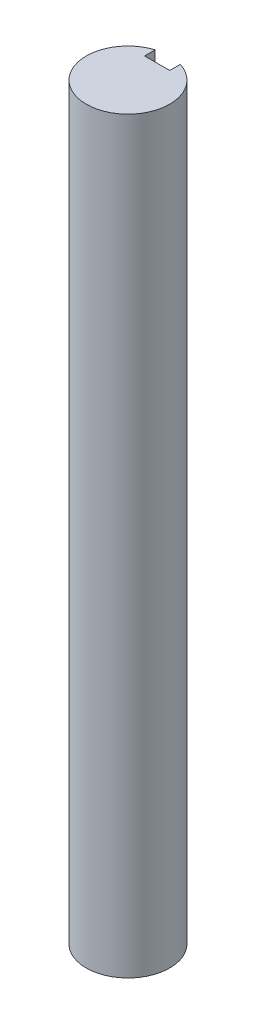
ISO-10303-21;
HEADER;
FILE_DESCRIPTION(('STEP AP214'),'2;1');
FILE_NAME('part.step','',(''),(''),'','','');
FILE_SCHEMA(('AUTOMOTIVE_DESIGN { 1 0 10303 214 1 1 1 1 }'));
ENDSEC;
DATA;
#1=APPLICATION_CONTEXT('core data for automotive mechanical design processes');
#2=APPLICATION_PROTOCOL_DEFINITION('international standard','automotive_design',2000,#1);
#3=PRODUCT_CONTEXT('',#1,'mechanical');
#4=PRODUCT('Part','Part','',(#3));
#5=PRODUCT_RELATED_PRODUCT_CATEGORY('part','',(#4));
#6=PRODUCT_DEFINITION_FORMATION('','',#4);
#7=PRODUCT_DEFINITION_CONTEXT('part definition',#1,'design');
#8=PRODUCT_DEFINITION('design','',#6,#7);
#9=PRODUCT_DEFINITION_SHAPE('','',#8);
#10=(LENGTH_UNIT() NAMED_UNIT(*) SI_UNIT(.MILLI.,.METRE.));
#11=(NAMED_UNIT(*) PLANE_ANGLE_UNIT() SI_UNIT($,.RADIAN.));
#12=(NAMED_UNIT(*) SI_UNIT($,.STERADIAN.) SOLID_ANGLE_UNIT());
#13=UNCERTAINTY_MEASURE_WITH_UNIT(LENGTH_MEASURE(1.E-05),#10,'distance_accuracy_value','');
#14=(GEOMETRIC_REPRESENTATION_CONTEXT(3) GLOBAL_UNCERTAINTY_ASSIGNED_CONTEXT((#13)) GLOBAL_UNIT_ASSIGNED_CONTEXT((#10,
#11,#12)) REPRESENTATION_CONTEXT('',''));
#15=CARTESIAN_POINT('',(0.,0.,0.));
#16=DIRECTION('',(0.,0.,1.));
#17=DIRECTION('',(1.,0.,0.));
#18=AXIS2_PLACEMENT_3D('',#15,#16,#17);
#19=CARTESIAN_POINT('',(0.,35.56,0.));
#20=DIRECTION('',(0.,-1.,0.));
#21=DIRECTION('',(0.,0.,-1.));
#22=AXIS2_PLACEMENT_3D('',#19,#20,#21);
#23=CYLINDRICAL_SURFACE('',#22,3.96875);
#24=CARTESIAN_POINT('',(0.,-35.56,0.));
#25=DIRECTION('',(0.,1.,0.));
#26=DIRECTION('',(0.,0.,1.));
#27=AXIS2_PLACEMENT_3D('',#24,#25,#26);
#28=CIRCLE('',#27,3.96875);
#29=CARTESIAN_POINT('',(-1.1938,-35.56,-3.78494625093937));
#30=VERTEX_POINT('',#29);
#31=CARTESIAN_POINT('',(1.1938,-35.56,-3.78494625093937));
#32=VERTEX_POINT('',#31);
#33=EDGE_CURVE('E115',#30,#32,#28,.T.);
#34=ORIENTED_EDGE('',*,*,#33,.T.);
#35=DIRECTION('',(0.,-1.,0.));
#36=VECTOR('',#35,1.);
#37=CARTESIAN_POINT('',(1.1938,35.56,-3.78494625093937));
#38=LINE('',#37,#36);
#39=CARTESIAN_POINT('',(1.1938,35.56,-3.78494625093937));
#40=VERTEX_POINT('',#39);
#41=EDGE_CURVE('E11',#40,#32,#38,.T.);
#42=ORIENTED_EDGE('',*,*,#41,.F.);
#43=CARTESIAN_POINT('',(0.,35.56,0.));
#44=DIRECTION('',(0.,1.,0.));
#45=DIRECTION('',(0.,0.,1.));
#46=AXIS2_PLACEMENT_3D('',#43,#44,#45);
#47=CIRCLE('',#46,3.96875);
#48=CARTESIAN_POINT('',(-1.1938,35.56,-3.78494625093937));
#49=VERTEX_POINT('',#48);
#50=EDGE_CURVE('E98',#49,#40,#47,.T.);
#51=ORIENTED_EDGE('',*,*,#50,.F.);
#52=DIRECTION('',(0.,-1.,0.));
#53=VECTOR('',#52,1.);
#54=CARTESIAN_POINT('',(-1.1938,35.56,-3.78494625093937));
#55=LINE('',#54,#53);
#56=EDGE_CURVE('E111',#49,#30,#55,.T.);
#57=ORIENTED_EDGE('',*,*,#56,.T.);
#58=EDGE_LOOP('',(#34,#42,#51,#57));
#59=FACE_BOUND('',#58,.T.);
#60=ADVANCED_FACE('F47',(#59),#23,.T.);
#61=CARTESIAN_POINT('',(1.1938,35.56,-3.78494625093937));
#62=DIRECTION('',(1.,0.,0.));
#63=DIRECTION('',(0.,0.,-1.));
#64=AXIS2_PLACEMENT_3D('',#61,#62,#63);
#65=PLANE('',#64);
#66=DIRECTION('',(0.,0.,1.));
#67=VECTOR('',#66,1.);
#68=CARTESIAN_POINT('',(1.1938,-35.56,-3.78494625093937));
#69=LINE('',#68,#67);
#70=CARTESIAN_POINT('',(1.1938,-35.56,-2.778125));
#71=VERTEX_POINT('',#70);
#72=EDGE_CURVE('E104',#32,#71,#69,.T.);
#73=ORIENTED_EDGE('',*,*,#72,.T.);
#74=DIRECTION('',(0.,-1.,0.));
#75=VECTOR('',#74,1.);
#76=CARTESIAN_POINT('',(1.1938,35.56,-2.778125));
#77=LINE('',#76,#75);
#78=CARTESIAN_POINT('',(1.1938,35.56,-2.778125));
#79=VERTEX_POINT('',#78);
#80=EDGE_CURVE('E56',#79,#71,#77,.T.);
#81=ORIENTED_EDGE('',*,*,#80,.F.);
#82=DIRECTION('',(0.,0.,1.));
#83=VECTOR('',#82,1.);
#84=CARTESIAN_POINT('',(1.1938,35.56,-3.78494625093937));
#85=LINE('',#84,#83);
#86=EDGE_CURVE('E93',#40,#79,#85,.T.);
#87=ORIENTED_EDGE('',*,*,#86,.F.);
#88=ORIENTED_EDGE('',*,*,#41,.T.);
#89=EDGE_LOOP('',(#73,#81,#87,#88));
#90=FACE_BOUND('',#89,.T.);
#91=ADVANCED_FACE('F103',(#90),#65,.F.);
#92=CARTESIAN_POINT('',(-1.1938,35.56,-2.778125));
#93=DIRECTION('',(0.,0.,1.));
#94=DIRECTION('',(1.,0.,0.));
#95=AXIS2_PLACEMENT_3D('',#92,#93,#94);
#96=PLANE('',#95);
#97=DIRECTION('',(-1.,0.,0.));
#98=VECTOR('',#97,1.);
#99=CARTESIAN_POINT('',(-1.1938,-35.56,-2.778125));
#100=LINE('',#99,#98);
#101=CARTESIAN_POINT('',(-1.1938,-35.56,-2.778125));
#102=VERTEX_POINT('',#101);
#103=EDGE_CURVE('E80',#71,#102,#100,.T.);
#104=ORIENTED_EDGE('',*,*,#103,.T.);
#105=DIRECTION('',(0.,-1.,0.));
#106=VECTOR('',#105,1.);
#107=CARTESIAN_POINT('',(-1.1938,35.56,-2.778125));
#108=LINE('',#107,#106);
#109=CARTESIAN_POINT('',(-1.1938,35.56,-2.778125));
#110=VERTEX_POINT('',#109);
#111=EDGE_CURVE('E106',#110,#102,#108,.T.);
#112=ORIENTED_EDGE('',*,*,#111,.F.);
#113=DIRECTION('',(-1.,0.,0.));
#114=VECTOR('',#113,1.);
#115=CARTESIAN_POINT('',(1.1938,35.56,-2.778125));
#116=LINE('',#115,#114);
#117=EDGE_CURVE('E96',#79,#110,#116,.T.);
#118=ORIENTED_EDGE('',*,*,#117,.F.);
#119=ORIENTED_EDGE('',*,*,#80,.T.);
#120=EDGE_LOOP('',(#104,#112,#118,#119));
#121=FACE_BOUND('',#120,.T.);
#122=ADVANCED_FACE('F107',(#121),#96,.F.);
#123=CARTESIAN_POINT('',(-1.1938,35.56,-3.78494625093937));
#124=DIRECTION('',(-1.,0.,0.));
#125=DIRECTION('',(0.,0.,1.));
#126=AXIS2_PLACEMENT_3D('',#123,#124,#125);
#127=PLANE('',#126);
#128=DIRECTION('',(0.,0.,-1.));
#129=VECTOR('',#128,1.);
#130=CARTESIAN_POINT('',(-1.1938,-35.56,-3.78494625093937));
#131=LINE('',#130,#129);
#132=EDGE_CURVE('E86',#102,#30,#131,.T.);
#133=ORIENTED_EDGE('',*,*,#132,.T.);
#134=ORIENTED_EDGE('',*,*,#56,.F.);
#135=DIRECTION('',(0.,0.,-1.));
#136=VECTOR('',#135,1.);
#137=CARTESIAN_POINT('',(-1.1938,35.56,-3.78494625093937));
#138=LINE('',#137,#136);
#139=EDGE_CURVE('E64',#110,#49,#138,.T.);
#140=ORIENTED_EDGE('',*,*,#139,.F.);
#141=ORIENTED_EDGE('',*,*,#111,.T.);
#142=EDGE_LOOP('',(#133,#134,#140,#141));
#143=FACE_BOUND('',#142,.T.);
#144=ADVANCED_FACE('F128',(#143),#127,.F.);
#145=CARTESIAN_POINT('',(0.,35.56,0.));
#146=DIRECTION('',(0.,1.,0.));
#147=DIRECTION('',(0.,0.,1.));
#148=AXIS2_PLACEMENT_3D('',#145,#146,#147);
#149=PLANE('',#148);
#150=ORIENTED_EDGE('',*,*,#50,.T.);
#151=ORIENTED_EDGE('',*,*,#86,.T.);
#152=ORIENTED_EDGE('',*,*,#117,.T.);
#153=ORIENTED_EDGE('',*,*,#139,.T.);
#154=EDGE_LOOP('',(#150,#151,#152,#153));
#155=FACE_BOUND('',#154,.T.);
#156=ADVANCED_FACE('F94',(#155),#149,.T.);
#157=CARTESIAN_POINT('',(0.,-35.56,0.));
#158=DIRECTION('',(0.,1.,0.));
#159=DIRECTION('',(0.,0.,1.));
#160=AXIS2_PLACEMENT_3D('',#157,#158,#159);
#161=PLANE('',#160);
#162=ORIENTED_EDGE('',*,*,#33,.F.);
#163=ORIENTED_EDGE('',*,*,#132,.F.);
#164=ORIENTED_EDGE('',*,*,#103,.F.);
#165=ORIENTED_EDGE('',*,*,#72,.F.);
#166=EDGE_LOOP('',(#162,#163,#164,#165));
#167=FACE_BOUND('',#166,.T.);
#168=ADVANCED_FACE('F131',(#167),#161,.F.);
#169=CLOSED_SHELL('',(#60,#91,#122,#144,#156,#168));
#170=MANIFOLD_SOLID_BREP('B2',#169);
#171=ADVANCED_BREP_SHAPE_REPRESENTATION('',(#18,#170),#14);
#172=SHAPE_DEFINITION_REPRESENTATION(#9,#171);
ENDSEC;
END-ISO-10303-21;
